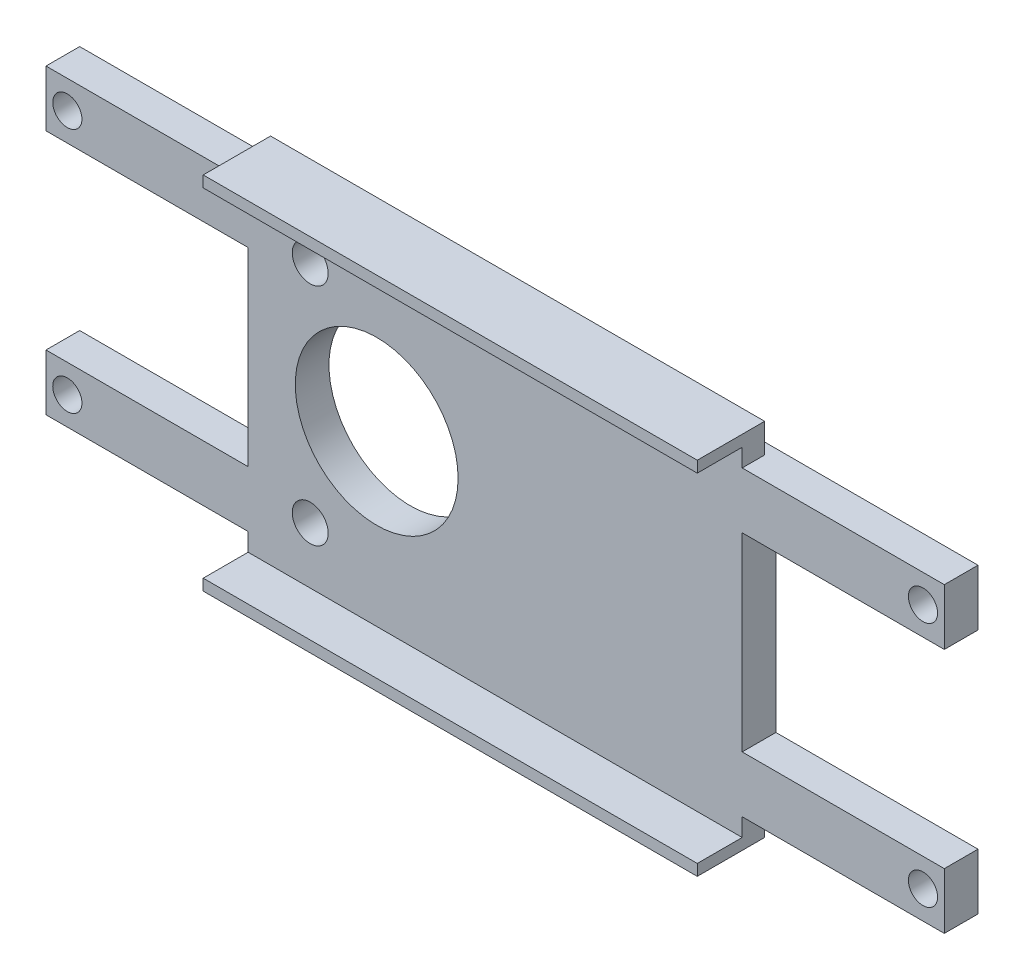
ISO-10303-21;
HEADER;
FILE_DESCRIPTION(('STEP AP214'),'2;1');
FILE_NAME('part.step','',(''),(''),'','','');
FILE_SCHEMA(('AUTOMOTIVE_DESIGN { 1 0 10303 214 1 1 1 1 }'));
ENDSEC;
DATA;
#1=APPLICATION_CONTEXT('core data for automotive mechanical design processes');
#2=APPLICATION_PROTOCOL_DEFINITION('international standard','automotive_design',2000,#1);
#3=PRODUCT_CONTEXT('',#1,'mechanical');
#4=PRODUCT('Part','Part','',(#3));
#5=PRODUCT_RELATED_PRODUCT_CATEGORY('part','',(#4));
#6=PRODUCT_DEFINITION_FORMATION('','',#4);
#7=PRODUCT_DEFINITION_CONTEXT('part definition',#1,'design');
#8=PRODUCT_DEFINITION('design','',#6,#7);
#9=PRODUCT_DEFINITION_SHAPE('','',#8);
#10=(LENGTH_UNIT() NAMED_UNIT(*) SI_UNIT(.MILLI.,.METRE.));
#11=(NAMED_UNIT(*) PLANE_ANGLE_UNIT() SI_UNIT($,.RADIAN.));
#12=(NAMED_UNIT(*) SI_UNIT($,.STERADIAN.) SOLID_ANGLE_UNIT());
#13=UNCERTAINTY_MEASURE_WITH_UNIT(LENGTH_MEASURE(1.E-05),#10,'distance_accuracy_value','');
#14=(GEOMETRIC_REPRESENTATION_CONTEXT(3) GLOBAL_UNCERTAINTY_ASSIGNED_CONTEXT((#13)) GLOBAL_UNIT_ASSIGNED_CONTEXT((#10,
#11,#12)) REPRESENTATION_CONTEXT('',''));
#15=CARTESIAN_POINT('',(0.,0.,0.));
#16=DIRECTION('',(0.,0.,1.));
#17=DIRECTION('',(1.,0.,0.));
#18=AXIS2_PLACEMENT_3D('',#15,#16,#17);
#19=CARTESIAN_POINT('',(0.,0.,3.));
#20=DIRECTION('',(0.,0.,-1.));
#21=DIRECTION('',(-1.,0.,0.));
#22=AXIS2_PLACEMENT_3D('',#19,#20,#21);
#23=PLANE('',#22);
#24=CARTESIAN_POINT('',(-16.47,23.47,3.));
#25=DIRECTION('',(0.,0.,1.));
#26=DIRECTION('',(1.,0.,0.));
#27=AXIS2_PLACEMENT_3D('',#24,#25,#26);
#28=CIRCLE('',#27,1.6);
#29=CARTESIAN_POINT('',(-14.87,23.47,3.));
#30=VERTEX_POINT('',#29);
#31=EDGE_CURVE('E297',#30,#30,#28,.T.);
#32=ORIENTED_EDGE('',*,*,#31,.F.);
#33=EDGE_LOOP('',(#32));
#34=FACE_BOUND('',#33,.T.);
#35=CARTESIAN_POINT('',(-16.47,3.43,3.));
#36=DIRECTION('',(0.,0.,1.));
#37=DIRECTION('',(-1.,0.,0.));
#38=AXIS2_PLACEMENT_3D('',#35,#36,#37);
#39=CIRCLE('',#38,1.6);
#40=CARTESIAN_POINT('',(-18.07,3.43,3.));
#41=VERTEX_POINT('',#40);
#42=EDGE_CURVE('E286',#41,#41,#39,.T.);
#43=ORIENTED_EDGE('',*,*,#42,.F.);
#44=EDGE_LOOP('',(#43));
#45=FACE_BOUND('',#44,.T.);
#46=CARTESIAN_POINT('',(-10.55,13.45,3.));
#47=DIRECTION('',(0.,0.,1.));
#48=DIRECTION('',(1.,0.,0.));
#49=AXIS2_PLACEMENT_3D('',#46,#47,#48);
#50=CIRCLE('',#49,7.25);
#51=CARTESIAN_POINT('',(-3.3,13.45,3.));
#52=VERTEX_POINT('',#51);
#53=EDGE_CURVE('E296',#52,#52,#50,.T.);
#54=ORIENTED_EDGE('',*,*,#53,.F.);
#55=EDGE_LOOP('',(#54));
#56=FACE_BOUND('',#55,.T.);
#57=CARTESIAN_POINT('',(-38.1,2.50000000000002,3.));
#58=DIRECTION('',(0.,0.,1.));
#59=DIRECTION('',(-1.,0.,0.));
#60=AXIS2_PLACEMENT_3D('',#57,#58,#59);
#61=CIRCLE('',#60,1.3);
#62=CARTESIAN_POINT('',(-39.4,2.50000000000002,3.));
#63=VERTEX_POINT('',#62);
#64=EDGE_CURVE('E331',#63,#63,#61,.T.);
#65=ORIENTED_EDGE('',*,*,#64,.F.);
#66=EDGE_LOOP('',(#65));
#67=FACE_BOUND('',#66,.T.);
#68=CARTESIAN_POINT('',(38.1,2.5,3.));
#69=DIRECTION('',(0.,0.,1.));
#70=DIRECTION('',(-1.,0.,0.));
#71=AXIS2_PLACEMENT_3D('',#68,#69,#70);
#72=CIRCLE('',#71,1.3);
#73=CARTESIAN_POINT('',(36.8,2.5,3.));
#74=VERTEX_POINT('',#73);
#75=EDGE_CURVE('E343',#74,#74,#72,.T.);
#76=ORIENTED_EDGE('',*,*,#75,.F.);
#77=EDGE_LOOP('',(#76));
#78=FACE_BOUND('',#77,.T.);
#79=CARTESIAN_POINT('',(38.1,24.4,3.));
#80=DIRECTION('',(0.,0.,1.));
#81=DIRECTION('',(1.,0.,0.));
#82=AXIS2_PLACEMENT_3D('',#79,#80,#81);
#83=CIRCLE('',#82,1.3);
#84=CARTESIAN_POINT('',(39.4,24.4,3.));
#85=VERTEX_POINT('',#84);
#86=EDGE_CURVE('E337',#85,#85,#83,.T.);
#87=ORIENTED_EDGE('',*,*,#86,.F.);
#88=EDGE_LOOP('',(#87));
#89=FACE_BOUND('',#88,.T.);
#90=CARTESIAN_POINT('',(-38.1,24.4,3.));
#91=DIRECTION('',(0.,0.,1.));
#92=DIRECTION('',(1.,0.,0.));
#93=AXIS2_PLACEMENT_3D('',#90,#91,#92);
#94=CIRCLE('',#93,1.3);
#95=CARTESIAN_POINT('',(-36.8,24.4,3.));
#96=VERTEX_POINT('',#95);
#97=EDGE_CURVE('E336',#96,#96,#94,.T.);
#98=ORIENTED_EDGE('',*,*,#97,.F.);
#99=EDGE_LOOP('',(#98));
#100=FACE_BOUND('',#99,.T.);
#101=DIRECTION('',(-1.,0.,0.));
#102=VECTOR('',#101,1.);
#103=CARTESIAN_POINT('',(-22.,-1.6,3.));
#104=LINE('',#103,#102);
#105=CARTESIAN_POINT('',(22.,-1.6,3.));
#106=VERTEX_POINT('',#105);
#107=CARTESIAN_POINT('',(-22.,-1.6,3.));
#108=VERTEX_POINT('',#107);
#109=EDGE_CURVE('E49',#106,#108,#104,.T.);
#110=ORIENTED_EDGE('',*,*,#109,.F.);
#111=DIRECTION('',(0.,1.,0.));
#112=VECTOR('',#111,1.);
#113=CARTESIAN_POINT('',(22.,-2.6,3.));
#114=LINE('',#113,#112);
#115=CARTESIAN_POINT('',(22.,0.,3.));
#116=VERTEX_POINT('',#115);
#117=EDGE_CURVE('E248',#106,#116,#114,.T.);
#118=ORIENTED_EDGE('',*,*,#117,.T.);
#119=DIRECTION('',(1.,0.,0.));
#120=VECTOR('',#119,1.);
#121=CARTESIAN_POINT('',(-40.,0.,3.));
#122=LINE('',#121,#120);
#123=CARTESIAN_POINT('',(40.,0.,3.));
#124=VERTEX_POINT('',#123);
#125=EDGE_CURVE('E381',#116,#124,#122,.T.);
#126=ORIENTED_EDGE('',*,*,#125,.T.);
#127=DIRECTION('',(0.,1.,0.));
#128=VECTOR('',#127,1.);
#129=CARTESIAN_POINT('',(40.,0.,3.));
#130=LINE('',#129,#128);
#131=CARTESIAN_POINT('',(40.,5.,3.));
#132=VERTEX_POINT('',#131);
#133=EDGE_CURVE('E357',#124,#132,#130,.T.);
#134=ORIENTED_EDGE('',*,*,#133,.T.);
#135=DIRECTION('',(-1.,0.,0.));
#136=VECTOR('',#135,1.);
#137=CARTESIAN_POINT('',(20.,5.,3.));
#138=LINE('',#137,#136);
#139=CARTESIAN_POINT('',(22.,5.,3.));
#140=VERTEX_POINT('',#139);
#141=EDGE_CURVE('E360',#132,#140,#138,.T.);
#142=ORIENTED_EDGE('',*,*,#141,.T.);
#143=DIRECTION('',(0.,1.,0.));
#144=VECTOR('',#143,1.);
#145=CARTESIAN_POINT('',(22.,5.,3.));
#146=LINE('',#145,#144);
#147=CARTESIAN_POINT('',(22.,21.9,3.));
#148=VERTEX_POINT('',#147);
#149=EDGE_CURVE('E308',#140,#148,#146,.T.);
#150=ORIENTED_EDGE('',*,*,#149,.T.);
#151=DIRECTION('',(1.,0.,0.));
#152=VECTOR('',#151,1.);
#153=CARTESIAN_POINT('',(40.,21.9,3.));
#154=LINE('',#153,#152);
#155=CARTESIAN_POINT('',(40.,21.9,3.));
#156=VERTEX_POINT('',#155);
#157=EDGE_CURVE('E364',#148,#156,#154,.T.);
#158=ORIENTED_EDGE('',*,*,#157,.T.);
#159=DIRECTION('',(0.,1.,0.));
#160=VECTOR('',#159,1.);
#161=CARTESIAN_POINT('',(40.,21.9,3.));
#162=LINE('',#161,#160);
#163=CARTESIAN_POINT('',(40.,26.9,3.));
#164=VERTEX_POINT('',#163);
#165=EDGE_CURVE('E366',#156,#164,#162,.T.);
#166=ORIENTED_EDGE('',*,*,#165,.T.);
#167=DIRECTION('',(-1.,0.,0.));
#168=VECTOR('',#167,1.);
#169=CARTESIAN_POINT('',(40.,26.9,3.));
#170=LINE('',#169,#168);
#171=CARTESIAN_POINT('',(22.,26.9,3.));
#172=VERTEX_POINT('',#171);
#173=EDGE_CURVE('E369',#164,#172,#170,.T.);
#174=ORIENTED_EDGE('',*,*,#173,.T.);
#175=DIRECTION('',(0.,1.,0.));
#176=VECTOR('',#175,1.);
#177=CARTESIAN_POINT('',(22.,29.5,3.));
#178=LINE('',#177,#176);
#179=CARTESIAN_POINT('',(22.,28.5,3.));
#180=VERTEX_POINT('',#179);
#181=EDGE_CURVE('E203',#172,#180,#178,.T.);
#182=ORIENTED_EDGE('',*,*,#181,.T.);
#183=DIRECTION('',(1.,0.,0.));
#184=VECTOR('',#183,1.);
#185=CARTESIAN_POINT('',(-22.,28.5,3.));
#186=LINE('',#185,#184);
#187=CARTESIAN_POINT('',(-22.,28.5,3.));
#188=VERTEX_POINT('',#187);
#189=EDGE_CURVE('E228',#188,#180,#186,.T.);
#190=ORIENTED_EDGE('',*,*,#189,.F.);
#191=DIRECTION('',(0.,-1.,0.));
#192=VECTOR('',#191,1.);
#193=CARTESIAN_POINT('',(-22.,26.9,3.));
#194=LINE('',#193,#192);
#195=CARTESIAN_POINT('',(-22.,26.9,3.));
#196=VERTEX_POINT('',#195);
#197=EDGE_CURVE('E271',#188,#196,#194,.T.);
#198=ORIENTED_EDGE('',*,*,#197,.T.);
#199=CARTESIAN_POINT('',(-40.,26.9,3.));
#200=VERTEX_POINT('',#199);
#201=EDGE_CURVE('E368',#196,#200,#170,.T.);
#202=ORIENTED_EDGE('',*,*,#201,.T.);
#203=DIRECTION('',(0.,-1.,0.));
#204=VECTOR('',#203,1.);
#205=CARTESIAN_POINT('',(-40.,21.9,3.));
#206=LINE('',#205,#204);
#207=CARTESIAN_POINT('',(-40.,21.9,3.));
#208=VERTEX_POINT('',#207);
#209=EDGE_CURVE('E372',#200,#208,#206,.T.);
#210=ORIENTED_EDGE('',*,*,#209,.T.);
#211=DIRECTION('',(1.,0.,0.));
#212=VECTOR('',#211,1.);
#213=CARTESIAN_POINT('',(-40.,21.9,3.));
#214=LINE('',#213,#212);
#215=CARTESIAN_POINT('',(-22.,21.9,3.));
#216=VERTEX_POINT('',#215);
#217=EDGE_CURVE('E374',#208,#216,#214,.T.);
#218=ORIENTED_EDGE('',*,*,#217,.T.);
#219=DIRECTION('',(0.,-1.,0.));
#220=VECTOR('',#219,1.);
#221=CARTESIAN_POINT('',(-22.,5.,3.));
#222=LINE('',#221,#220);
#223=CARTESIAN_POINT('',(-22.,5.,3.));
#224=VERTEX_POINT('',#223);
#225=EDGE_CURVE('E320',#216,#224,#222,.T.);
#226=ORIENTED_EDGE('',*,*,#225,.T.);
#227=DIRECTION('',(-1.,0.,0.));
#228=VECTOR('',#227,1.);
#229=CARTESIAN_POINT('',(-20.,5.,3.));
#230=LINE('',#229,#228);
#231=CARTESIAN_POINT('',(-40.,5.00000000000001,3.));
#232=VERTEX_POINT('',#231);
#233=EDGE_CURVE('E377',#224,#232,#230,.T.);
#234=ORIENTED_EDGE('',*,*,#233,.T.);
#235=DIRECTION('',(0.,-1.,0.));
#236=VECTOR('',#235,1.);
#237=CARTESIAN_POINT('',(-40.,0.,3.));
#238=LINE('',#237,#236);
#239=CARTESIAN_POINT('',(-40.,0.,3.));
#240=VERTEX_POINT('',#239);
#241=EDGE_CURVE('E379',#232,#240,#238,.T.);
#242=ORIENTED_EDGE('',*,*,#241,.T.);
#243=CARTESIAN_POINT('',(-22.,0.,3.));
#244=VERTEX_POINT('',#243);
#245=EDGE_CURVE('E382',#240,#244,#122,.T.);
#246=ORIENTED_EDGE('',*,*,#245,.T.);
#247=DIRECTION('',(0.,-1.,0.));
#248=VECTOR('',#247,1.);
#249=CARTESIAN_POINT('',(-22.,0.,3.));
#250=LINE('',#249,#248);
#251=EDGE_CURVE('E54',#244,#108,#250,.T.);
#252=ORIENTED_EDGE('',*,*,#251,.T.);
#253=EDGE_LOOP('',(#110,#118,#126,#134,#142,#150,#158,#166,#174,#182,#190,#198,#202,#210,#218,
#226,#234,#242,#246,#252));
#254=FACE_BOUND('',#253,.T.);
#255=ADVANCED_FACE('F34',(#34,#45,#56,#67,#78,#89,#100,#254),#23,.F.);
#256=CARTESIAN_POINT('',(-40.,0.,3.));
#257=DIRECTION('',(0.,1.,0.));
#258=DIRECTION('',(-1.,0.,0.));
#259=AXIS2_PLACEMENT_3D('',#256,#257,#258);
#260=PLANE('',#259);
#261=DIRECTION('',(0.,0.,1.));
#262=VECTOR('',#261,1.);
#263=CARTESIAN_POINT('',(22.,0.,1.));
#264=LINE('',#263,#262);
#265=CARTESIAN_POINT('',(22.,0.,1.));
#266=VERTEX_POINT('',#265);
#267=EDGE_CURVE('E258',#266,#116,#264,.T.);
#268=ORIENTED_EDGE('',*,*,#267,.F.);
#269=DIRECTION('',(-1.,0.,0.));
#270=VECTOR('',#269,1.);
#271=CARTESIAN_POINT('',(22.,0.,1.));
#272=LINE('',#271,#270);
#273=CARTESIAN_POINT('',(-22.,0.,1.));
#274=VERTEX_POINT('',#273);
#275=EDGE_CURVE('E251',#266,#274,#272,.T.);
#276=ORIENTED_EDGE('',*,*,#275,.T.);
#277=DIRECTION('',(0.,0.,1.));
#278=VECTOR('',#277,1.);
#279=CARTESIAN_POINT('',(-22.,0.,1.));
#280=LINE('',#279,#278);
#281=EDGE_CURVE('E262',#274,#244,#280,.T.);
#282=ORIENTED_EDGE('',*,*,#281,.T.);
#283=ORIENTED_EDGE('',*,*,#245,.F.);
#284=DIRECTION('',(0.,0.,-1.));
#285=VECTOR('',#284,1.);
#286=CARTESIAN_POINT('',(-40.,0.,3.));
#287=LINE('',#286,#285);
#288=CARTESIAN_POINT('',(-40.,0.,0.));
#289=VERTEX_POINT('',#288);
#290=EDGE_CURVE('E406',#240,#289,#287,.T.);
#291=ORIENTED_EDGE('',*,*,#290,.T.);
#292=DIRECTION('',(1.,0.,0.));
#293=VECTOR('',#292,1.);
#294=CARTESIAN_POINT('',(-40.,0.,0.));
#295=LINE('',#294,#293);
#296=CARTESIAN_POINT('',(40.,0.,0.));
#297=VERTEX_POINT('',#296);
#298=EDGE_CURVE('E361',#289,#297,#295,.T.);
#299=ORIENTED_EDGE('',*,*,#298,.T.);
#300=DIRECTION('',(0.,0.,-1.));
#301=VECTOR('',#300,1.);
#302=CARTESIAN_POINT('',(40.,0.,3.));
#303=LINE('',#302,#301);
#304=EDGE_CURVE('E384',#124,#297,#303,.T.);
#305=ORIENTED_EDGE('',*,*,#304,.F.);
#306=ORIENTED_EDGE('',*,*,#125,.F.);
#307=EDGE_LOOP('',(#268,#276,#282,#283,#291,#299,#305,#306));
#308=FACE_BOUND('',#307,.T.);
#309=ADVANCED_FACE('F477',(#308),#260,.F.);
#310=CARTESIAN_POINT('',(40.,26.9,3.));
#311=DIRECTION('',(0.,-1.,0.));
#312=DIRECTION('',(1.,0.,0.));
#313=AXIS2_PLACEMENT_3D('',#310,#311,#312);
#314=PLANE('',#313);
#315=DIRECTION('',(0.,0.,1.));
#316=VECTOR('',#315,1.);
#317=CARTESIAN_POINT('',(-22.,26.9,1.));
#318=LINE('',#317,#316);
#319=CARTESIAN_POINT('',(-22.,26.9,1.));
#320=VERTEX_POINT('',#319);
#321=EDGE_CURVE('E283',#320,#196,#318,.T.);
#322=ORIENTED_EDGE('',*,*,#321,.F.);
#323=DIRECTION('',(1.,0.,0.));
#324=VECTOR('',#323,1.);
#325=CARTESIAN_POINT('',(22.,26.9,1.));
#326=LINE('',#325,#324);
#327=CARTESIAN_POINT('',(22.,26.9,1.));
#328=VERTEX_POINT('',#327);
#329=EDGE_CURVE('E267',#320,#328,#326,.T.);
#330=ORIENTED_EDGE('',*,*,#329,.T.);
#331=DIRECTION('',(0.,0.,1.));
#332=VECTOR('',#331,1.);
#333=CARTESIAN_POINT('',(22.,26.9,1.));
#334=LINE('',#333,#332);
#335=EDGE_CURVE('E280',#328,#172,#334,.T.);
#336=ORIENTED_EDGE('',*,*,#335,.T.);
#337=ORIENTED_EDGE('',*,*,#173,.F.);
#338=DIRECTION('',(0.,0.,-1.));
#339=VECTOR('',#338,1.);
#340=CARTESIAN_POINT('',(40.,26.9,3.));
#341=LINE('',#340,#339);
#342=CARTESIAN_POINT('',(40.,26.9,0.));
#343=VERTEX_POINT('',#342);
#344=EDGE_CURVE('E418',#164,#343,#341,.T.);
#345=ORIENTED_EDGE('',*,*,#344,.T.);
#346=DIRECTION('',(-1.,0.,0.));
#347=VECTOR('',#346,1.);
#348=CARTESIAN_POINT('',(40.,26.9,0.));
#349=LINE('',#348,#347);
#350=CARTESIAN_POINT('',(-40.,26.9,0.));
#351=VERTEX_POINT('',#350);
#352=EDGE_CURVE('E393',#343,#351,#349,.T.);
#353=ORIENTED_EDGE('',*,*,#352,.T.);
#354=DIRECTION('',(0.,0.,-1.));
#355=VECTOR('',#354,1.);
#356=CARTESIAN_POINT('',(-40.,26.9,3.));
#357=LINE('',#356,#355);
#358=EDGE_CURVE('E415',#200,#351,#357,.T.);
#359=ORIENTED_EDGE('',*,*,#358,.F.);
#360=ORIENTED_EDGE('',*,*,#201,.F.);
#361=EDGE_LOOP('',(#322,#330,#336,#337,#345,#353,#359,#360));
#362=FACE_BOUND('',#361,.T.);
#363=ADVANCED_FACE('F439',(#362),#314,.F.);
#364=CARTESIAN_POINT('',(40.,0.,3.));
#365=DIRECTION('',(-1.,0.,0.));
#366=DIRECTION('',(0.,-1.,0.));
#367=AXIS2_PLACEMENT_3D('',#364,#365,#366);
#368=PLANE('',#367);
#369=DIRECTION('',(0.,1.,0.));
#370=VECTOR('',#369,1.);
#371=CARTESIAN_POINT('',(40.,0.,0.));
#372=LINE('',#371,#370);
#373=CARTESIAN_POINT('',(40.,5.,0.));
#374=VERTEX_POINT('',#373);
#375=EDGE_CURVE('E354',#297,#374,#372,.T.);
#376=ORIENTED_EDGE('',*,*,#375,.T.);
#377=DIRECTION('',(0.,0.,-1.));
#378=VECTOR('',#377,1.);
#379=CARTESIAN_POINT('',(40.,5.,3.));
#380=LINE('',#379,#378);
#381=EDGE_CURVE('E11',#132,#374,#380,.T.);
#382=ORIENTED_EDGE('',*,*,#381,.F.);
#383=ORIENTED_EDGE('',*,*,#133,.F.);
#384=ORIENTED_EDGE('',*,*,#304,.T.);
#385=EDGE_LOOP('',(#376,#382,#383,#384));
#386=FACE_BOUND('',#385,.T.);
#387=ADVANCED_FACE('F36',(#386),#368,.F.);
#388=CARTESIAN_POINT('',(20.,5.,3.));
#389=DIRECTION('',(0.,-1.,0.));
#390=DIRECTION('',(0.,0.,-1.));
#391=AXIS2_PLACEMENT_3D('',#388,#389,#390);
#392=PLANE('',#391);
#393=DIRECTION('',(-1.,0.,0.));
#394=VECTOR('',#393,1.);
#395=CARTESIAN_POINT('',(20.,5.,0.));
#396=LINE('',#395,#394);
#397=CARTESIAN_POINT('',(22.,5.,0.));
#398=VERTEX_POINT('',#397);
#399=EDGE_CURVE('E387',#374,#398,#396,.T.);
#400=ORIENTED_EDGE('',*,*,#399,.T.);
#401=DIRECTION('',(0.,0.,1.));
#402=VECTOR('',#401,1.);
#403=CARTESIAN_POINT('',(22.,5.,0.));
#404=LINE('',#403,#402);
#405=EDGE_CURVE('E314',#398,#140,#404,.T.);
#406=ORIENTED_EDGE('',*,*,#405,.T.);
#407=ORIENTED_EDGE('',*,*,#141,.F.);
#408=ORIENTED_EDGE('',*,*,#381,.T.);
#409=EDGE_LOOP('',(#400,#406,#407,#408));
#410=FACE_BOUND('',#409,.T.);
#411=ADVANCED_FACE('F470',(#410),#392,.F.);
#412=CARTESIAN_POINT('',(40.,21.9,3.));
#413=DIRECTION('',(0.,1.,0.));
#414=DIRECTION('',(-1.,0.,0.));
#415=AXIS2_PLACEMENT_3D('',#412,#413,#414);
#416=PLANE('',#415);
#417=ORIENTED_EDGE('',*,*,#157,.F.);
#418=DIRECTION('',(0.,0.,1.));
#419=VECTOR('',#418,1.);
#420=CARTESIAN_POINT('',(22.,21.9,0.));
#421=LINE('',#420,#419);
#422=CARTESIAN_POINT('',(22.,21.9,0.));
#423=VERTEX_POINT('',#422);
#424=EDGE_CURVE('E317',#423,#148,#421,.T.);
#425=ORIENTED_EDGE('',*,*,#424,.F.);
#426=DIRECTION('',(1.,0.,0.));
#427=VECTOR('',#426,1.);
#428=CARTESIAN_POINT('',(40.,21.9,0.));
#429=LINE('',#428,#427);
#430=CARTESIAN_POINT('',(40.,21.9,0.));
#431=VERTEX_POINT('',#430);
#432=EDGE_CURVE('E389',#423,#431,#429,.T.);
#433=ORIENTED_EDGE('',*,*,#432,.T.);
#434=DIRECTION('',(0.,0.,-1.));
#435=VECTOR('',#434,1.);
#436=CARTESIAN_POINT('',(40.,21.9,3.));
#437=LINE('',#436,#435);
#438=EDGE_CURVE('E42',#156,#431,#437,.T.);
#439=ORIENTED_EDGE('',*,*,#438,.F.);
#440=EDGE_LOOP('',(#417,#425,#433,#439));
#441=FACE_BOUND('',#440,.T.);
#442=ADVANCED_FACE('F462',(#441),#416,.F.);
#443=CARTESIAN_POINT('',(40.,21.9,3.));
#444=DIRECTION('',(-1.,0.,0.));
#445=DIRECTION('',(0.,0.,1.));
#446=AXIS2_PLACEMENT_3D('',#443,#444,#445);
#447=PLANE('',#446);
#448=DIRECTION('',(0.,1.,0.));
#449=VECTOR('',#448,1.);
#450=CARTESIAN_POINT('',(40.,21.9,0.));
#451=LINE('',#450,#449);
#452=EDGE_CURVE('E391',#431,#343,#451,.T.);
#453=ORIENTED_EDGE('',*,*,#452,.T.);
#454=ORIENTED_EDGE('',*,*,#344,.F.);
#455=ORIENTED_EDGE('',*,*,#165,.F.);
#456=ORIENTED_EDGE('',*,*,#438,.T.);
#457=EDGE_LOOP('',(#453,#454,#455,#456));
#458=FACE_BOUND('',#457,.T.);
#459=ADVANCED_FACE('F425',(#458),#447,.F.);
#460=CARTESIAN_POINT('',(-40.,21.9,3.));
#461=DIRECTION('',(1.,0.,0.));
#462=DIRECTION('',(0.,0.,-1.));
#463=AXIS2_PLACEMENT_3D('',#460,#461,#462);
#464=PLANE('',#463);
#465=DIRECTION('',(0.,-1.,0.));
#466=VECTOR('',#465,1.);
#467=CARTESIAN_POINT('',(-40.,21.9,0.));
#468=LINE('',#467,#466);
#469=CARTESIAN_POINT('',(-40.,21.9,0.));
#470=VERTEX_POINT('',#469);
#471=EDGE_CURVE('E395',#351,#470,#468,.T.);
#472=ORIENTED_EDGE('',*,*,#471,.T.);
#473=DIRECTION('',(0.,0.,-1.));
#474=VECTOR('',#473,1.);
#475=CARTESIAN_POINT('',(-40.,21.9,3.));
#476=LINE('',#475,#474);
#477=EDGE_CURVE('E412',#208,#470,#476,.T.);
#478=ORIENTED_EDGE('',*,*,#477,.F.);
#479=ORIENTED_EDGE('',*,*,#209,.F.);
#480=ORIENTED_EDGE('',*,*,#358,.T.);
#481=EDGE_LOOP('',(#472,#478,#479,#480));
#482=FACE_BOUND('',#481,.T.);
#483=ADVANCED_FACE('F444',(#482),#464,.F.);
#484=CARTESIAN_POINT('',(-40.,21.9,3.));
#485=DIRECTION('',(0.,1.,0.));
#486=DIRECTION('',(-1.,0.,0.));
#487=AXIS2_PLACEMENT_3D('',#484,#485,#486);
#488=PLANE('',#487);
#489=DIRECTION('',(1.,0.,0.));
#490=VECTOR('',#489,1.);
#491=CARTESIAN_POINT('',(-40.,21.9,0.));
#492=LINE('',#491,#490);
#493=CARTESIAN_POINT('',(-22.,21.9,0.));
#494=VERTEX_POINT('',#493);
#495=EDGE_CURVE('E397',#470,#494,#492,.T.);
#496=ORIENTED_EDGE('',*,*,#495,.T.);
#497=DIRECTION('',(0.,0.,1.));
#498=VECTOR('',#497,1.);
#499=CARTESIAN_POINT('',(-22.,21.9,0.));
#500=LINE('',#499,#498);
#501=EDGE_CURVE('E325',#494,#216,#500,.T.);
#502=ORIENTED_EDGE('',*,*,#501,.T.);
#503=ORIENTED_EDGE('',*,*,#217,.F.);
#504=ORIENTED_EDGE('',*,*,#477,.T.);
#505=EDGE_LOOP('',(#496,#502,#503,#504));
#506=FACE_BOUND('',#505,.T.);
#507=ADVANCED_FACE('F493',(#506),#488,.F.);
#508=CARTESIAN_POINT('',(-20.,5.,3.));
#509=DIRECTION('',(0.,-1.,0.));
#510=DIRECTION('',(1.,0.,0.));
#511=AXIS2_PLACEMENT_3D('',#508,#509,#510);
#512=PLANE('',#511);
#513=ORIENTED_EDGE('',*,*,#233,.F.);
#514=DIRECTION('',(0.,0.,1.));
#515=VECTOR('',#514,1.);
#516=CARTESIAN_POINT('',(-22.,5.,0.));
#517=LINE('',#516,#515);
#518=CARTESIAN_POINT('',(-22.,5.,0.));
#519=VERTEX_POINT('',#518);
#520=EDGE_CURVE('E328',#519,#224,#517,.T.);
#521=ORIENTED_EDGE('',*,*,#520,.F.);
#522=DIRECTION('',(-1.,0.,0.));
#523=VECTOR('',#522,1.);
#524=CARTESIAN_POINT('',(-20.,5.,0.));
#525=LINE('',#524,#523);
#526=CARTESIAN_POINT('',(-40.,5.00000000000001,0.));
#527=VERTEX_POINT('',#526);
#528=EDGE_CURVE('E399',#519,#527,#525,.T.);
#529=ORIENTED_EDGE('',*,*,#528,.T.);
#530=DIRECTION('',(0.,0.,-1.));
#531=VECTOR('',#530,1.);
#532=CARTESIAN_POINT('',(-40.,5.00000000000001,3.));
#533=LINE('',#532,#531);
#534=EDGE_CURVE('E409',#232,#527,#533,.T.);
#535=ORIENTED_EDGE('',*,*,#534,.F.);
#536=EDGE_LOOP('',(#513,#521,#529,#535));
#537=FACE_BOUND('',#536,.T.);
#538=ADVANCED_FACE('F488',(#537),#512,.F.);
#539=CARTESIAN_POINT('',(-40.,0.,3.));
#540=DIRECTION('',(1.,0.,0.));
#541=DIRECTION('',(0.,1.,0.));
#542=AXIS2_PLACEMENT_3D('',#539,#540,#541);
#543=PLANE('',#542);
#544=DIRECTION('',(0.,-1.,0.));
#545=VECTOR('',#544,1.);
#546=CARTESIAN_POINT('',(-40.,0.,0.));
#547=LINE('',#546,#545);
#548=EDGE_CURVE('E401',#527,#289,#547,.T.);
#549=ORIENTED_EDGE('',*,*,#548,.T.);
#550=ORIENTED_EDGE('',*,*,#290,.F.);
#551=ORIENTED_EDGE('',*,*,#241,.F.);
#552=ORIENTED_EDGE('',*,*,#534,.T.);
#553=EDGE_LOOP('',(#549,#550,#551,#552));
#554=FACE_BOUND('',#553,.T.);
#555=ADVANCED_FACE('F484',(#554),#543,.F.);
#556=CARTESIAN_POINT('',(0.,0.,0.));
#557=DIRECTION('',(0.,0.,-1.));
#558=DIRECTION('',(-1.,0.,0.));
#559=AXIS2_PLACEMENT_3D('',#556,#557,#558);
#560=PLANE('',#559);
#561=CARTESIAN_POINT('',(-16.47,23.47,0.));
#562=DIRECTION('',(0.,0.,1.));
#563=DIRECTION('',(1.,0.,0.));
#564=AXIS2_PLACEMENT_3D('',#561,#562,#563);
#565=CIRCLE('',#564,1.6);
#566=CARTESIAN_POINT('',(-14.87,23.47,0.));
#567=VERTEX_POINT('',#566);
#568=EDGE_CURVE('E293',#567,#567,#565,.T.);
#569=ORIENTED_EDGE('',*,*,#568,.T.);
#570=EDGE_LOOP('',(#569));
#571=FACE_BOUND('',#570,.T.);
#572=CARTESIAN_POINT('',(-16.47,3.43,0.));
#573=DIRECTION('',(0.,0.,1.));
#574=DIRECTION('',(-1.,0.,0.));
#575=AXIS2_PLACEMENT_3D('',#572,#573,#574);
#576=CIRCLE('',#575,1.6);
#577=CARTESIAN_POINT('',(-18.07,3.43,0.));
#578=VERTEX_POINT('',#577);
#579=EDGE_CURVE('E300',#578,#578,#576,.T.);
#580=ORIENTED_EDGE('',*,*,#579,.T.);
#581=EDGE_LOOP('',(#580));
#582=FACE_BOUND('',#581,.T.);
#583=CARTESIAN_POINT('',(-10.55,13.45,0.));
#584=DIRECTION('',(0.,0.,1.));
#585=DIRECTION('',(1.,0.,0.));
#586=AXIS2_PLACEMENT_3D('',#583,#584,#585);
#587=CIRCLE('',#586,7.25);
#588=CARTESIAN_POINT('',(-3.3,13.45,0.));
#589=VERTEX_POINT('',#588);
#590=EDGE_CURVE('E305',#589,#589,#587,.T.);
#591=ORIENTED_EDGE('',*,*,#590,.T.);
#592=EDGE_LOOP('',(#591));
#593=FACE_BOUND('',#592,.T.);
#594=ORIENTED_EDGE('',*,*,#432,.F.);
#595=DIRECTION('',(0.,1.,0.));
#596=VECTOR('',#595,1.);
#597=CARTESIAN_POINT('',(22.,5.,0.));
#598=LINE('',#597,#596);
#599=EDGE_CURVE('E311',#398,#423,#598,.T.);
#600=ORIENTED_EDGE('',*,*,#599,.F.);
#601=ORIENTED_EDGE('',*,*,#399,.F.);
#602=ORIENTED_EDGE('',*,*,#375,.F.);
#603=ORIENTED_EDGE('',*,*,#298,.F.);
#604=ORIENTED_EDGE('',*,*,#548,.F.);
#605=ORIENTED_EDGE('',*,*,#528,.F.);
#606=DIRECTION('',(0.,-1.,0.));
#607=VECTOR('',#606,1.);
#608=CARTESIAN_POINT('',(-22.,5.,0.));
#609=LINE('',#608,#607);
#610=EDGE_CURVE('E322',#494,#519,#609,.T.);
#611=ORIENTED_EDGE('',*,*,#610,.F.);
#612=ORIENTED_EDGE('',*,*,#495,.F.);
#613=ORIENTED_EDGE('',*,*,#471,.F.);
#614=ORIENTED_EDGE('',*,*,#352,.F.);
#615=ORIENTED_EDGE('',*,*,#452,.F.);
#616=EDGE_LOOP('',(#594,#600,#601,#602,#603,#604,#605,#611,#612,#613,#614,#615));
#617=FACE_BOUND('',#616,.T.);
#618=CARTESIAN_POINT('',(-38.1,2.50000000000002,0.));
#619=DIRECTION('',(0.,0.,1.));
#620=DIRECTION('',(-1.,0.,0.));
#621=AXIS2_PLACEMENT_3D('',#618,#619,#620);
#622=CIRCLE('',#621,1.3);
#623=CARTESIAN_POINT('',(-39.4,2.50000000000002,0.));
#624=VERTEX_POINT('',#623);
#625=EDGE_CURVE('E346',#624,#624,#622,.T.);
#626=ORIENTED_EDGE('',*,*,#625,.T.);
#627=EDGE_LOOP('',(#626));
#628=FACE_BOUND('',#627,.T.);
#629=CARTESIAN_POINT('',(38.1,2.5,0.));
#630=DIRECTION('',(0.,0.,1.));
#631=DIRECTION('',(-1.,0.,0.));
#632=AXIS2_PLACEMENT_3D('',#629,#630,#631);
#633=CIRCLE('',#632,1.3);
#634=CARTESIAN_POINT('',(36.8,2.5,0.));
#635=VERTEX_POINT('',#634);
#636=EDGE_CURVE('E340',#635,#635,#633,.T.);
#637=ORIENTED_EDGE('',*,*,#636,.T.);
#638=EDGE_LOOP('',(#637));
#639=FACE_BOUND('',#638,.T.);
#640=CARTESIAN_POINT('',(38.1,24.4,0.));
#641=DIRECTION('',(0.,0.,1.));
#642=DIRECTION('',(1.,0.,0.));
#643=AXIS2_PLACEMENT_3D('',#640,#641,#642);
#644=CIRCLE('',#643,1.3);
#645=CARTESIAN_POINT('',(39.4,24.4,0.));
#646=VERTEX_POINT('',#645);
#647=EDGE_CURVE('E333',#646,#646,#644,.T.);
#648=ORIENTED_EDGE('',*,*,#647,.T.);
#649=EDGE_LOOP('',(#648));
#650=FACE_BOUND('',#649,.T.);
#651=CARTESIAN_POINT('',(-38.1,24.4,0.));
#652=DIRECTION('',(0.,0.,1.));
#653=DIRECTION('',(1.,0.,0.));
#654=AXIS2_PLACEMENT_3D('',#651,#652,#653);
#655=CIRCLE('',#654,1.3);
#656=CARTESIAN_POINT('',(-36.8,24.4,0.));
#657=VERTEX_POINT('',#656);
#658=EDGE_CURVE('E351',#657,#657,#655,.T.);
#659=ORIENTED_EDGE('',*,*,#658,.T.);
#660=EDGE_LOOP('',(#659));
#661=FACE_BOUND('',#660,.T.);
#662=ADVANCED_FACE('F431',(#571,#582,#593,#617,#628,#639,#650,#661),#560,.T.);
#663=CARTESIAN_POINT('',(-38.1,24.4,0.));
#664=DIRECTION('',(0.,0.,1.));
#665=DIRECTION('',(1.,0.,0.));
#666=AXIS2_PLACEMENT_3D('',#663,#664,#665);
#667=CYLINDRICAL_SURFACE('',#666,1.3);
#668=ORIENTED_EDGE('',*,*,#658,.F.);
#669=EDGE_LOOP('',(#668));
#670=FACE_BOUND('',#669,.T.);
#671=ORIENTED_EDGE('',*,*,#97,.T.);
#672=EDGE_LOOP('',(#671));
#673=FACE_BOUND('',#672,.T.);
#674=ADVANCED_FACE('F513',(#670,#673),#667,.F.);
#675=CARTESIAN_POINT('',(38.1,24.4,0.));
#676=DIRECTION('',(0.,0.,1.));
#677=DIRECTION('',(1.,0.,0.));
#678=AXIS2_PLACEMENT_3D('',#675,#676,#677);
#679=CYLINDRICAL_SURFACE('',#678,1.3);
#680=ORIENTED_EDGE('',*,*,#647,.F.);
#681=EDGE_LOOP('',(#680));
#682=FACE_BOUND('',#681,.T.);
#683=ORIENTED_EDGE('',*,*,#86,.T.);
#684=EDGE_LOOP('',(#683));
#685=FACE_BOUND('',#684,.T.);
#686=ADVANCED_FACE('F536',(#682,#685),#679,.F.);
#687=CARTESIAN_POINT('',(38.1,2.5,0.));
#688=DIRECTION('',(0.,0.,1.));
#689=DIRECTION('',(1.,0.,0.));
#690=AXIS2_PLACEMENT_3D('',#687,#688,#689);
#691=CYLINDRICAL_SURFACE('',#690,1.3);
#692=ORIENTED_EDGE('',*,*,#636,.F.);
#693=EDGE_LOOP('',(#692));
#694=FACE_BOUND('',#693,.T.);
#695=ORIENTED_EDGE('',*,*,#75,.T.);
#696=EDGE_LOOP('',(#695));
#697=FACE_BOUND('',#696,.T.);
#698=ADVANCED_FACE('F543',(#694,#697),#691,.F.);
#699=CARTESIAN_POINT('',(-38.1,2.50000000000002,0.));
#700=DIRECTION('',(0.,0.,1.));
#701=DIRECTION('',(1.,0.,0.));
#702=AXIS2_PLACEMENT_3D('',#699,#700,#701);
#703=CYLINDRICAL_SURFACE('',#702,1.3);
#704=ORIENTED_EDGE('',*,*,#625,.F.);
#705=EDGE_LOOP('',(#704));
#706=FACE_BOUND('',#705,.T.);
#707=ORIENTED_EDGE('',*,*,#64,.T.);
#708=EDGE_LOOP('',(#707));
#709=FACE_BOUND('',#708,.T.);
#710=ADVANCED_FACE('F551',(#706,#709),#703,.F.);
#711=CARTESIAN_POINT('',(-22.,5.,0.));
#712=DIRECTION('',(-1.,0.,0.));
#713=DIRECTION('',(0.,0.,1.));
#714=AXIS2_PLACEMENT_3D('',#711,#712,#713);
#715=PLANE('',#714);
#716=ORIENTED_EDGE('',*,*,#225,.F.);
#717=ORIENTED_EDGE('',*,*,#501,.F.);
#718=ORIENTED_EDGE('',*,*,#610,.T.);
#719=ORIENTED_EDGE('',*,*,#520,.T.);
#720=EDGE_LOOP('',(#716,#717,#718,#719));
#721=FACE_BOUND('',#720,.T.);
#722=ADVANCED_FACE('F491',(#721),#715,.T.);
#723=CARTESIAN_POINT('',(22.,5.,0.));
#724=DIRECTION('',(1.,0.,0.));
#725=DIRECTION('',(0.,0.,-1.));
#726=AXIS2_PLACEMENT_3D('',#723,#724,#725);
#727=PLANE('',#726);
#728=ORIENTED_EDGE('',*,*,#149,.F.);
#729=ORIENTED_EDGE('',*,*,#405,.F.);
#730=ORIENTED_EDGE('',*,*,#599,.T.);
#731=ORIENTED_EDGE('',*,*,#424,.T.);
#732=EDGE_LOOP('',(#728,#729,#730,#731));
#733=FACE_BOUND('',#732,.T.);
#734=ADVANCED_FACE('F464',(#733),#727,.T.);
#735=CARTESIAN_POINT('',(-10.55,13.45,0.));
#736=DIRECTION('',(0.,0.,1.));
#737=DIRECTION('',(1.,0.,0.));
#738=AXIS2_PLACEMENT_3D('',#735,#736,#737);
#739=CYLINDRICAL_SURFACE('',#738,7.25);
#740=ORIENTED_EDGE('',*,*,#590,.F.);
#741=EDGE_LOOP('',(#740));
#742=FACE_BOUND('',#741,.T.);
#743=ORIENTED_EDGE('',*,*,#53,.T.);
#744=EDGE_LOOP('',(#743));
#745=FACE_BOUND('',#744,.T.);
#746=ADVANCED_FACE('F572',(#742,#745),#739,.F.);
#747=CARTESIAN_POINT('',(-16.47,3.43,0.));
#748=DIRECTION('',(0.,0.,1.));
#749=DIRECTION('',(1.,0.,0.));
#750=AXIS2_PLACEMENT_3D('',#747,#748,#749);
#751=CYLINDRICAL_SURFACE('',#750,1.6);
#752=ORIENTED_EDGE('',*,*,#579,.F.);
#753=EDGE_LOOP('',(#752));
#754=FACE_BOUND('',#753,.T.);
#755=ORIENTED_EDGE('',*,*,#42,.T.);
#756=EDGE_LOOP('',(#755));
#757=FACE_BOUND('',#756,.T.);
#758=ADVANCED_FACE('F578',(#754,#757),#751,.F.);
#759=CARTESIAN_POINT('',(-16.47,23.47,0.));
#760=DIRECTION('',(0.,0.,1.));
#761=DIRECTION('',(1.,0.,0.));
#762=AXIS2_PLACEMENT_3D('',#759,#760,#761);
#763=CYLINDRICAL_SURFACE('',#762,1.6);
#764=ORIENTED_EDGE('',*,*,#568,.F.);
#765=EDGE_LOOP('',(#764));
#766=FACE_BOUND('',#765,.T.);
#767=ORIENTED_EDGE('',*,*,#31,.T.);
#768=EDGE_LOOP('',(#767));
#769=FACE_BOUND('',#768,.T.);
#770=ADVANCED_FACE('F585',(#766,#769),#763,.F.);
#771=CARTESIAN_POINT('',(-22.,26.9,1.));
#772=DIRECTION('',(-1.,0.,0.));
#773=DIRECTION('',(0.,-1.,0.));
#774=AXIS2_PLACEMENT_3D('',#771,#772,#773);
#775=PLANE('',#774);
#776=ORIENTED_EDGE('',*,*,#197,.F.);
#777=DIRECTION('',(0.,0.,-1.));
#778=VECTOR('',#777,1.);
#779=CARTESIAN_POINT('',(-22.,28.5,7.));
#780=LINE('',#779,#778);
#781=CARTESIAN_POINT('',(-22.,28.5,7.));
#782=VERTEX_POINT('',#781);
#783=EDGE_CURVE('E245',#782,#188,#780,.T.);
#784=ORIENTED_EDGE('',*,*,#783,.F.);
#785=DIRECTION('',(0.,-1.,0.));
#786=VECTOR('',#785,1.);
#787=CARTESIAN_POINT('',(-22.,29.5,7.));
#788=LINE('',#787,#786);
#789=CARTESIAN_POINT('',(-22.,29.5,7.));
#790=VERTEX_POINT('',#789);
#791=EDGE_CURVE('E229',#790,#782,#788,.T.);
#792=ORIENTED_EDGE('',*,*,#791,.F.);
#793=DIRECTION('',(0.,0.,1.));
#794=VECTOR('',#793,1.);
#795=CARTESIAN_POINT('',(-22.,29.5,1.));
#796=LINE('',#795,#794);
#797=CARTESIAN_POINT('',(-22.,29.5,1.));
#798=VERTEX_POINT('',#797);
#799=EDGE_CURVE('E287',#798,#790,#796,.T.);
#800=ORIENTED_EDGE('',*,*,#799,.F.);
#801=DIRECTION('',(0.,-1.,0.));
#802=VECTOR('',#801,1.);
#803=CARTESIAN_POINT('',(-22.,26.9,1.));
#804=LINE('',#803,#802);
#805=EDGE_CURVE('E277',#798,#320,#804,.T.);
#806=ORIENTED_EDGE('',*,*,#805,.T.);
#807=ORIENTED_EDGE('',*,*,#321,.T.);
#808=EDGE_LOOP('',(#776,#784,#792,#800,#806,#807));
#809=FACE_BOUND('',#808,.T.);
#810=ADVANCED_FACE('F450',(#809),#775,.T.);
#811=CARTESIAN_POINT('',(-22.,29.5,1.));
#812=DIRECTION('',(0.,1.,0.));
#813=DIRECTION('',(0.,0.,1.));
#814=AXIS2_PLACEMENT_3D('',#811,#812,#813);
#815=PLANE('',#814);
#816=ORIENTED_EDGE('',*,*,#799,.T.);
#817=DIRECTION('',(-1.,0.,0.));
#818=VECTOR('',#817,1.);
#819=CARTESIAN_POINT('',(-22.,29.5,7.));
#820=LINE('',#819,#818);
#821=CARTESIAN_POINT('',(22.,29.5,7.));
#822=VERTEX_POINT('',#821);
#823=EDGE_CURVE('E237',#822,#790,#820,.T.);
#824=ORIENTED_EDGE('',*,*,#823,.F.);
#825=DIRECTION('',(0.,0.,1.));
#826=VECTOR('',#825,1.);
#827=CARTESIAN_POINT('',(22.,29.5,1.));
#828=LINE('',#827,#826);
#829=CARTESIAN_POINT('',(22.,29.5,1.));
#830=VERTEX_POINT('',#829);
#831=EDGE_CURVE('E289',#830,#822,#828,.T.);
#832=ORIENTED_EDGE('',*,*,#831,.F.);
#833=DIRECTION('',(-1.,0.,0.));
#834=VECTOR('',#833,1.);
#835=CARTESIAN_POINT('',(-22.,29.5,1.));
#836=LINE('',#835,#834);
#837=EDGE_CURVE('E274',#830,#798,#836,.T.);
#838=ORIENTED_EDGE('',*,*,#837,.T.);
#839=EDGE_LOOP('',(#816,#824,#832,#838));
#840=FACE_BOUND('',#839,.T.);
#841=ADVANCED_FACE('F601',(#840),#815,.T.);
#842=CARTESIAN_POINT('',(22.,29.5,1.));
#843=DIRECTION('',(1.,0.,0.));
#844=DIRECTION('',(0.,1.,0.));
#845=AXIS2_PLACEMENT_3D('',#842,#843,#844);
#846=PLANE('',#845);
#847=ORIENTED_EDGE('',*,*,#181,.F.);
#848=ORIENTED_EDGE('',*,*,#335,.F.);
#849=DIRECTION('',(0.,1.,0.));
#850=VECTOR('',#849,1.);
#851=CARTESIAN_POINT('',(22.,29.5,1.));
#852=LINE('',#851,#850);
#853=EDGE_CURVE('E270',#328,#830,#852,.T.);
#854=ORIENTED_EDGE('',*,*,#853,.T.);
#855=ORIENTED_EDGE('',*,*,#831,.T.);
#856=DIRECTION('',(0.,1.,0.));
#857=VECTOR('',#856,1.);
#858=CARTESIAN_POINT('',(22.,29.5,7.));
#859=LINE('',#858,#857);
#860=CARTESIAN_POINT('',(22.,28.5,7.));
#861=VERTEX_POINT('',#860);
#862=EDGE_CURVE('E234',#861,#822,#859,.T.);
#863=ORIENTED_EDGE('',*,*,#862,.F.);
#864=DIRECTION('',(0.,0.,-1.));
#865=VECTOR('',#864,1.);
#866=CARTESIAN_POINT('',(22.,28.5,7.));
#867=LINE('',#866,#865);
#868=EDGE_CURVE('E240',#861,#180,#867,.T.);
#869=ORIENTED_EDGE('',*,*,#868,.T.);
#870=EDGE_LOOP('',(#847,#848,#854,#855,#863,#869));
#871=FACE_BOUND('',#870,.T.);
#872=ADVANCED_FACE('F459',(#871),#846,.T.);
#873=CARTESIAN_POINT('',(0.,0.,1.));
#874=DIRECTION('',(0.,0.,-1.));
#875=DIRECTION('',(-1.,0.,0.));
#876=AXIS2_PLACEMENT_3D('',#873,#874,#875);
#877=PLANE('',#876);
#878=ORIENTED_EDGE('',*,*,#329,.F.);
#879=ORIENTED_EDGE('',*,*,#805,.F.);
#880=ORIENTED_EDGE('',*,*,#837,.F.);
#881=ORIENTED_EDGE('',*,*,#853,.F.);
#882=EDGE_LOOP('',(#878,#879,#880,#881));
#883=FACE_BOUND('',#882,.T.);
#884=ADVANCED_FACE('F456',(#883),#877,.T.);
#885=CARTESIAN_POINT('',(22.,-2.6,1.));
#886=DIRECTION('',(1.,0.,0.));
#887=DIRECTION('',(0.,1.,0.));
#888=AXIS2_PLACEMENT_3D('',#885,#886,#887);
#889=PLANE('',#888);
#890=ORIENTED_EDGE('',*,*,#117,.F.);
#891=DIRECTION('',(0.,0.,-1.));
#892=VECTOR('',#891,1.);
#893=CARTESIAN_POINT('',(22.,-1.6,7.));
#894=LINE('',#893,#892);
#895=CARTESIAN_POINT('',(22.,-1.6,7.));
#896=VERTEX_POINT('',#895);
#897=EDGE_CURVE('E210',#896,#106,#894,.T.);
#898=ORIENTED_EDGE('',*,*,#897,.F.);
#899=DIRECTION('',(0.,1.,0.));
#900=VECTOR('',#899,1.);
#901=CARTESIAN_POINT('',(22.,-2.6,7.));
#902=LINE('',#901,#900);
#903=CARTESIAN_POINT('',(22.,-2.6,7.));
#904=VERTEX_POINT('',#903);
#905=EDGE_CURVE('E207',#904,#896,#902,.T.);
#906=ORIENTED_EDGE('',*,*,#905,.F.);
#907=DIRECTION('',(0.,0.,1.));
#908=VECTOR('',#907,1.);
#909=CARTESIAN_POINT('',(22.,-2.6,1.));
#910=LINE('',#909,#908);
#911=CARTESIAN_POINT('',(22.,-2.6,1.));
#912=VERTEX_POINT('',#911);
#913=EDGE_CURVE('E193',#912,#904,#910,.T.);
#914=ORIENTED_EDGE('',*,*,#913,.F.);
#915=DIRECTION('',(0.,1.,0.));
#916=VECTOR('',#915,1.);
#917=CARTESIAN_POINT('',(22.,-2.6,1.));
#918=LINE('',#917,#916);
#919=EDGE_CURVE('E249',#912,#266,#918,.T.);
#920=ORIENTED_EDGE('',*,*,#919,.T.);
#921=ORIENTED_EDGE('',*,*,#267,.T.);
#922=EDGE_LOOP('',(#890,#898,#906,#914,#920,#921));
#923=FACE_BOUND('',#922,.T.);
#924=ADVANCED_FACE('F208',(#923),#889,.T.);
#925=CARTESIAN_POINT('',(-22.,-2.6,1.));
#926=DIRECTION('',(0.,-1.,0.));
#927=DIRECTION('',(0.,0.,-1.));
#928=AXIS2_PLACEMENT_3D('',#925,#926,#927);
#929=PLANE('',#928);
#930=ORIENTED_EDGE('',*,*,#913,.T.);
#931=DIRECTION('',(1.,0.,0.));
#932=VECTOR('',#931,1.);
#933=CARTESIAN_POINT('',(-22.,-2.6,7.));
#934=LINE('',#933,#932);
#935=CARTESIAN_POINT('',(-22.,-2.6,7.));
#936=VERTEX_POINT('',#935);
#937=EDGE_CURVE('E197',#936,#904,#934,.T.);
#938=ORIENTED_EDGE('',*,*,#937,.F.);
#939=DIRECTION('',(0.,0.,1.));
#940=VECTOR('',#939,1.);
#941=CARTESIAN_POINT('',(-22.,-2.6,1.));
#942=LINE('',#941,#940);
#943=CARTESIAN_POINT('',(-22.,-2.6,1.));
#944=VERTEX_POINT('',#943);
#945=EDGE_CURVE('E204',#944,#936,#942,.T.);
#946=ORIENTED_EDGE('',*,*,#945,.F.);
#947=DIRECTION('',(1.,0.,0.));
#948=VECTOR('',#947,1.);
#949=CARTESIAN_POINT('',(-22.,-2.6,1.));
#950=LINE('',#949,#948);
#951=EDGE_CURVE('E199',#944,#912,#950,.T.);
#952=ORIENTED_EDGE('',*,*,#951,.T.);
#953=EDGE_LOOP('',(#930,#938,#946,#952));
#954=FACE_BOUND('',#953,.T.);
#955=ADVANCED_FACE('F195',(#954),#929,.T.);
#956=CARTESIAN_POINT('',(-22.,0.,1.));
#957=DIRECTION('',(-1.,0.,0.));
#958=DIRECTION('',(0.,-1.,0.));
#959=AXIS2_PLACEMENT_3D('',#956,#957,#958);
#960=PLANE('',#959);
#961=ORIENTED_EDGE('',*,*,#251,.F.);
#962=ORIENTED_EDGE('',*,*,#281,.F.);
#963=DIRECTION('',(0.,-1.,0.));
#964=VECTOR('',#963,1.);
#965=CARTESIAN_POINT('',(-22.,0.,1.));
#966=LINE('',#965,#964);
#967=EDGE_CURVE('E254',#274,#944,#966,.T.);
#968=ORIENTED_EDGE('',*,*,#967,.T.);
#969=ORIENTED_EDGE('',*,*,#945,.T.);
#970=DIRECTION('',(0.,-1.,0.));
#971=VECTOR('',#970,1.);
#972=CARTESIAN_POINT('',(-22.,-2.6,7.));
#973=LINE('',#972,#971);
#974=CARTESIAN_POINT('',(-22.,-1.6,7.));
#975=VERTEX_POINT('',#974);
#976=EDGE_CURVE('E218',#975,#936,#973,.T.);
#977=ORIENTED_EDGE('',*,*,#976,.F.);
#978=DIRECTION('',(0.,0.,-1.));
#979=VECTOR('',#978,1.);
#980=CARTESIAN_POINT('',(-22.,-1.6,7.));
#981=LINE('',#980,#979);
#982=EDGE_CURVE('E223',#975,#108,#981,.T.);
#983=ORIENTED_EDGE('',*,*,#982,.T.);
#984=EDGE_LOOP('',(#961,#962,#968,#969,#977,#983));
#985=FACE_BOUND('',#984,.T.);
#986=ADVANCED_FACE('F635',(#985),#960,.T.);
#987=CARTESIAN_POINT('',(0.,0.,1.));
#988=DIRECTION('',(0.,0.,1.));
#989=DIRECTION('',(1.,0.,0.));
#990=AXIS2_PLACEMENT_3D('',#987,#988,#989);
#991=PLANE('',#990);
#992=ORIENTED_EDGE('',*,*,#919,.F.);
#993=ORIENTED_EDGE('',*,*,#951,.F.);
#994=ORIENTED_EDGE('',*,*,#967,.F.);
#995=ORIENTED_EDGE('',*,*,#275,.F.);
#996=EDGE_LOOP('',(#992,#993,#994,#995));
#997=FACE_BOUND('',#996,.T.);
#998=ADVANCED_FACE('F642',(#997),#991,.F.);
#999=CARTESIAN_POINT('',(-22.,28.5,7.));
#1000=DIRECTION('',(0.,1.,0.));
#1001=DIRECTION('',(0.,0.,1.));
#1002=AXIS2_PLACEMENT_3D('',#999,#1000,#1001);
#1003=PLANE('',#1002);
#1004=ORIENTED_EDGE('',*,*,#189,.T.);
#1005=ORIENTED_EDGE('',*,*,#868,.F.);
#1006=DIRECTION('',(1.,0.,0.));
#1007=VECTOR('',#1006,1.);
#1008=CARTESIAN_POINT('',(-22.,28.5,7.));
#1009=LINE('',#1008,#1007);
#1010=EDGE_CURVE('E232',#782,#861,#1009,.T.);
#1011=ORIENTED_EDGE('',*,*,#1010,.F.);
#1012=ORIENTED_EDGE('',*,*,#783,.T.);
#1013=EDGE_LOOP('',(#1004,#1005,#1011,#1012));
#1014=FACE_BOUND('',#1013,.T.);
#1015=ADVANCED_FACE('F650',(#1014),#1003,.F.);
#1016=CARTESIAN_POINT('',(0.,0.,7.));
#1017=DIRECTION('',(0.,0.,1.));
#1018=DIRECTION('',(1.,0.,0.));
#1019=AXIS2_PLACEMENT_3D('',#1016,#1017,#1018);
#1020=PLANE('',#1019);
#1021=ORIENTED_EDGE('',*,*,#791,.T.);
#1022=ORIENTED_EDGE('',*,*,#1010,.T.);
#1023=ORIENTED_EDGE('',*,*,#862,.T.);
#1024=ORIENTED_EDGE('',*,*,#823,.T.);
#1025=EDGE_LOOP('',(#1021,#1022,#1023,#1024));
#1026=FACE_BOUND('',#1025,.T.);
#1027=ADVANCED_FACE('F657',(#1026),#1020,.T.);
#1028=CARTESIAN_POINT('',(-22.,-1.6,7.));
#1029=DIRECTION('',(0.,-1.,0.));
#1030=DIRECTION('',(0.,0.,-1.));
#1031=AXIS2_PLACEMENT_3D('',#1028,#1029,#1030);
#1032=PLANE('',#1031);
#1033=ORIENTED_EDGE('',*,*,#109,.T.);
#1034=ORIENTED_EDGE('',*,*,#982,.F.);
#1035=DIRECTION('',(-1.,0.,0.));
#1036=VECTOR('',#1035,1.);
#1037=CARTESIAN_POINT('',(-22.,-1.6,7.));
#1038=LINE('',#1037,#1036);
#1039=EDGE_CURVE('E213',#896,#975,#1038,.T.);
#1040=ORIENTED_EDGE('',*,*,#1039,.F.);
#1041=ORIENTED_EDGE('',*,*,#897,.T.);
#1042=EDGE_LOOP('',(#1033,#1034,#1040,#1041));
#1043=FACE_BOUND('',#1042,.T.);
#1044=ADVANCED_FACE('F665',(#1043),#1032,.F.);
#1045=CARTESIAN_POINT('',(0.,0.,7.));
#1046=DIRECTION('',(0.,0.,1.));
#1047=DIRECTION('',(1.,0.,0.));
#1048=AXIS2_PLACEMENT_3D('',#1045,#1046,#1047);
#1049=PLANE('',#1048);
#1050=ORIENTED_EDGE('',*,*,#937,.T.);
#1051=ORIENTED_EDGE('',*,*,#905,.T.);
#1052=ORIENTED_EDGE('',*,*,#1039,.T.);
#1053=ORIENTED_EDGE('',*,*,#976,.T.);
#1054=EDGE_LOOP('',(#1050,#1051,#1052,#1053));
#1055=FACE_BOUND('',#1054,.T.);
#1056=ADVANCED_FACE('F216',(#1055),#1049,.T.);
#1057=CLOSED_SHELL('',(#255,#309,#363,#387,#411,#442,#459,#483,#507,#538,#555,#662,#674,#686,
#698,#710,#722,#734,#746,#758,#770,#810,#841,#872,#884,#924,#955,#986,#998,#1015,#1027,#1044,#1056));
#1058=MANIFOLD_SOLID_BREP('B2',#1057);
#1059=ADVANCED_BREP_SHAPE_REPRESENTATION('',(#18,#1058),#14);
#1060=SHAPE_DEFINITION_REPRESENTATION(#9,#1059);
ENDSEC;
END-ISO-10303-21;
